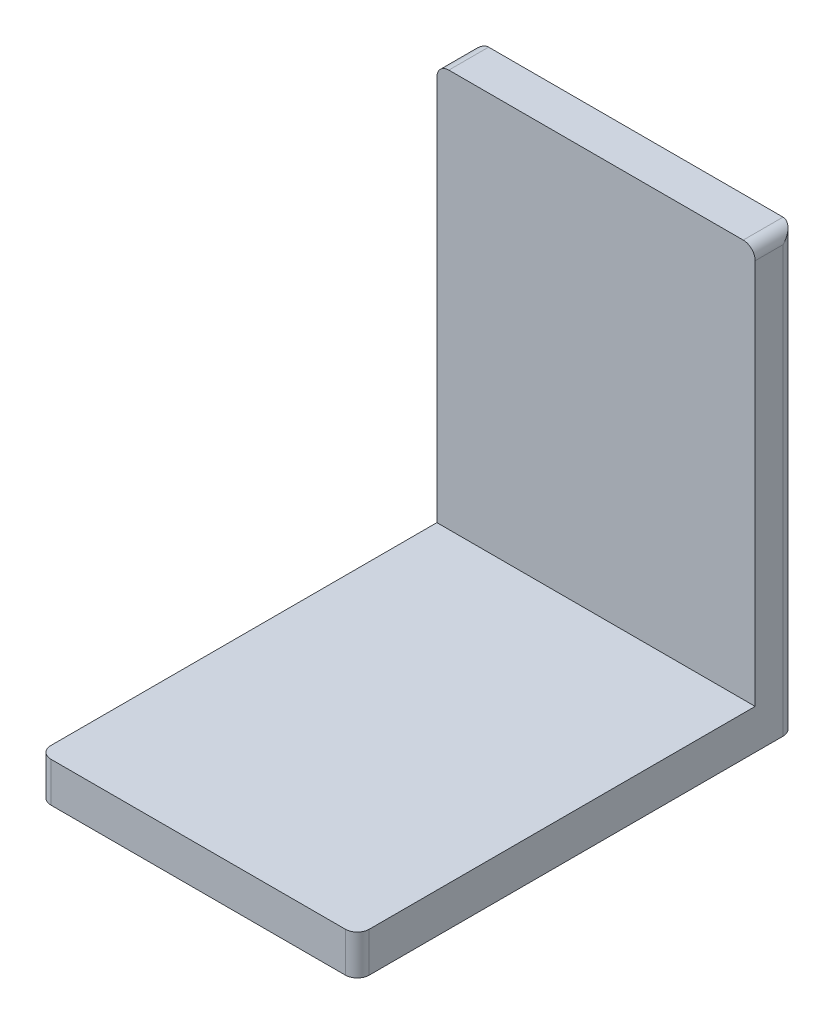
ISO-10303-21;
HEADER;
FILE_DESCRIPTION(('STEP AP214'),'2;1');
FILE_NAME('part.step','',(''),(''),'','','');
FILE_SCHEMA(('AUTOMOTIVE_DESIGN { 1 0 10303 214 1 1 1 1 }'));
ENDSEC;
DATA;
#1=APPLICATION_CONTEXT('core data for automotive mechanical design processes');
#2=APPLICATION_PROTOCOL_DEFINITION('international standard','automotive_design',2000,#1);
#3=PRODUCT_CONTEXT('',#1,'mechanical');
#4=PRODUCT('Part','Part','',(#3));
#5=PRODUCT_RELATED_PRODUCT_CATEGORY('part','',(#4));
#6=PRODUCT_DEFINITION_FORMATION('','',#4);
#7=PRODUCT_DEFINITION_CONTEXT('part definition',#1,'design');
#8=PRODUCT_DEFINITION('design','',#6,#7);
#9=PRODUCT_DEFINITION_SHAPE('','',#8);
#10=(LENGTH_UNIT() NAMED_UNIT(*) SI_UNIT(.MILLI.,.METRE.));
#11=(NAMED_UNIT(*) PLANE_ANGLE_UNIT() SI_UNIT($,.RADIAN.));
#12=(NAMED_UNIT(*) SI_UNIT($,.STERADIAN.) SOLID_ANGLE_UNIT());
#13=UNCERTAINTY_MEASURE_WITH_UNIT(LENGTH_MEASURE(1.E-05),#10,'distance_accuracy_value','');
#14=(GEOMETRIC_REPRESENTATION_CONTEXT(3) GLOBAL_UNCERTAINTY_ASSIGNED_CONTEXT((#13)) GLOBAL_UNIT_ASSIGNED_CONTEXT((#10,
#11,#12)) REPRESENTATION_CONTEXT('',''));
#15=CARTESIAN_POINT('',(0.,0.,0.));
#16=DIRECTION('',(0.,0.,1.));
#17=DIRECTION('',(1.,0.,0.));
#18=AXIS2_PLACEMENT_3D('',#15,#16,#17);
#19=CARTESIAN_POINT('',(80.,-10.,0.));
#20=DIRECTION('',(0.,-1.,0.));
#21=DIRECTION('',(0.,0.,-1.));
#22=AXIS2_PLACEMENT_3D('',#19,#20,#21);
#23=PLANE('',#22);
#24=DIRECTION('',(-1.,0.,0.));
#25=VECTOR('',#24,1.);
#26=CARTESIAN_POINT('',(80.,-10.,0.));
#27=LINE('',#26,#25);
#28=CARTESIAN_POINT('',(77.,-10.,0.));
#29=VERTEX_POINT('',#28);
#30=CARTESIAN_POINT('',(3.,-10.,0.));
#31=VERTEX_POINT('',#30);
#32=EDGE_CURVE('E131',#29,#31,#27,.T.);
#33=ORIENTED_EDGE('',*,*,#32,.T.);
#34=CARTESIAN_POINT('',(3.,-10.,-3.));
#35=DIRECTION('',(0.,-1.,0.));
#36=DIRECTION('',(0.,0.,-1.));
#37=AXIS2_PLACEMENT_3D('',#34,#35,#36);
#38=CIRCLE('',#37,3.);
#39=CARTESIAN_POINT('',(0.,-10.,-3.));
#40=VERTEX_POINT('',#39);
#41=EDGE_CURVE('E46',#31,#40,#38,.T.);
#42=ORIENTED_EDGE('',*,*,#41,.T.);
#43=DIRECTION('',(0.,0.,1.));
#44=VECTOR('',#43,1.);
#45=CARTESIAN_POINT('',(0.,-10.,0.));
#46=LINE('',#45,#44);
#47=CARTESIAN_POINT('',(0.,-9.99999999999999,-107.));
#48=VERTEX_POINT('',#47);
#49=EDGE_CURVE('E152',#48,#40,#46,.T.);
#50=ORIENTED_EDGE('',*,*,#49,.F.);
#51=CARTESIAN_POINT('',(3.,-9.99999999999999,-107.));
#52=DIRECTION('',(0.,-1.,0.));
#53=DIRECTION('',(0.,0.,-1.));
#54=AXIS2_PLACEMENT_3D('',#51,#52,#53);
#55=CIRCLE('',#54,3.);
#56=CARTESIAN_POINT('',(3.,-9.99999999999999,-110.));
#57=VERTEX_POINT('',#56);
#58=EDGE_CURVE('E173',#48,#57,#55,.T.);
#59=ORIENTED_EDGE('',*,*,#58,.T.);
#60=DIRECTION('',(-1.,0.,0.));
#61=VECTOR('',#60,1.);
#62=CARTESIAN_POINT('',(80.,-9.99999999999999,-110.));
#63=LINE('',#62,#61);
#64=CARTESIAN_POINT('',(77.,-9.99999999999999,-110.));
#65=VERTEX_POINT('',#64);
#66=EDGE_CURVE('E164',#65,#57,#63,.T.);
#67=ORIENTED_EDGE('',*,*,#66,.F.);
#68=CARTESIAN_POINT('',(77.,-9.99999999999999,-107.));
#69=DIRECTION('',(0.,-1.,0.));
#70=DIRECTION('',(0.,0.,-1.));
#71=AXIS2_PLACEMENT_3D('',#68,#69,#70);
#72=CIRCLE('',#71,3.);
#73=CARTESIAN_POINT('',(80.,-9.99999999999999,-107.));
#74=VERTEX_POINT('',#73);
#75=EDGE_CURVE('E171',#65,#74,#72,.T.);
#76=ORIENTED_EDGE('',*,*,#75,.T.);
#77=DIRECTION('',(0.,0.,1.));
#78=VECTOR('',#77,1.);
#79=CARTESIAN_POINT('',(80.,-10.,0.));
#80=LINE('',#79,#78);
#81=CARTESIAN_POINT('',(80.,-10.,-3.));
#82=VERTEX_POINT('',#81);
#83=EDGE_CURVE('E147',#74,#82,#80,.T.);
#84=ORIENTED_EDGE('',*,*,#83,.T.);
#85=CARTESIAN_POINT('',(77.,-10.,-3.));
#86=DIRECTION('',(0.,-1.,0.));
#87=DIRECTION('',(0.,0.,-1.));
#88=AXIS2_PLACEMENT_3D('',#85,#86,#87);
#89=CIRCLE('',#88,3.);
#90=EDGE_CURVE('E207',#82,#29,#89,.T.);
#91=ORIENTED_EDGE('',*,*,#90,.T.);
#92=EDGE_LOOP('',(#33,#42,#50,#59,#67,#76,#84,#91));
#93=FACE_BOUND('',#92,.T.);
#94=ADVANCED_FACE('F38',(#93),#23,.T.);
#95=CARTESIAN_POINT('',(80.,0.,-110.));
#96=DIRECTION('',(0.,0.,-1.));
#97=DIRECTION('',(0.,1.,0.));
#98=AXIS2_PLACEMENT_3D('',#95,#96,#97);
#99=PLANE('',#98);
#100=ORIENTED_EDGE('',*,*,#66,.T.);
#101=DIRECTION('',(0.,-1.,0.));
#102=VECTOR('',#101,1.);
#103=CARTESIAN_POINT('',(3.,100.,-110.));
#104=LINE('',#103,#102);
#105=CARTESIAN_POINT('',(3.,100.,-110.));
#106=VERTEX_POINT('',#105);
#107=EDGE_CURVE('E179',#57,#106,#104,.F.);
#108=ORIENTED_EDGE('',*,*,#107,.T.);
#109=DIRECTION('',(-1.,0.,0.));
#110=VECTOR('',#109,1.);
#111=CARTESIAN_POINT('',(80.,100.,-110.));
#112=LINE('',#111,#110);
#113=CARTESIAN_POINT('',(77.,100.,-110.));
#114=VERTEX_POINT('',#113);
#115=EDGE_CURVE('E161',#114,#106,#112,.T.);
#116=ORIENTED_EDGE('',*,*,#115,.F.);
#117=DIRECTION('',(0.,-1.,0.));
#118=VECTOR('',#117,1.);
#119=CARTESIAN_POINT('',(77.,0.,-110.));
#120=LINE('',#119,#118);
#121=EDGE_CURVE('E176',#114,#65,#120,.T.);
#122=ORIENTED_EDGE('',*,*,#121,.T.);
#123=EDGE_LOOP('',(#100,#108,#116,#122));
#124=FACE_BOUND('',#123,.T.);
#125=ADVANCED_FACE('F244',(#124),#99,.T.);
#126=CARTESIAN_POINT('',(80.,100.,0.));
#127=DIRECTION('',(0.,1.,0.));
#128=DIRECTION('',(0.,0.,1.));
#129=AXIS2_PLACEMENT_3D('',#126,#127,#128);
#130=PLANE('',#129);
#131=ORIENTED_EDGE('',*,*,#115,.T.);
#132=DIRECTION('',(0.,0.,-1.));
#133=VECTOR('',#132,1.);
#134=CARTESIAN_POINT('',(3.,100.,-100.));
#135=LINE('',#134,#133);
#136=CARTESIAN_POINT('',(3.,100.,-100.));
#137=VERTEX_POINT('',#136);
#138=EDGE_CURVE('E186',#106,#137,#135,.F.);
#139=ORIENTED_EDGE('',*,*,#138,.T.);
#140=DIRECTION('',(-1.,0.,0.));
#141=VECTOR('',#140,1.);
#142=CARTESIAN_POINT('',(80.,100.,-100.));
#143=LINE('',#142,#141);
#144=CARTESIAN_POINT('',(77.,100.,-100.));
#145=VERTEX_POINT('',#144);
#146=EDGE_CURVE('E141',#145,#137,#143,.T.);
#147=ORIENTED_EDGE('',*,*,#146,.F.);
#148=DIRECTION('',(0.,0.,-1.));
#149=VECTOR('',#148,1.);
#150=CARTESIAN_POINT('',(77.,100.,0.));
#151=LINE('',#150,#149);
#152=EDGE_CURVE('E184',#145,#114,#151,.T.);
#153=ORIENTED_EDGE('',*,*,#152,.T.);
#154=EDGE_LOOP('',(#131,#139,#147,#153));
#155=FACE_BOUND('',#154,.T.);
#156=ADVANCED_FACE('F233',(#155),#130,.T.);
#157=CARTESIAN_POINT('',(80.,0.,-100.));
#158=DIRECTION('',(0.,0.,1.));
#159=DIRECTION('',(1.,0.,0.));
#160=AXIS2_PLACEMENT_3D('',#157,#158,#159);
#161=PLANE('',#160);
#162=ORIENTED_EDGE('',*,*,#146,.T.);
#163=CARTESIAN_POINT('',(3.,97.,-100.));
#164=DIRECTION('',(0.,0.,1.));
#165=DIRECTION('',(1.,0.,0.));
#166=AXIS2_PLACEMENT_3D('',#163,#164,#165);
#167=CIRCLE('',#166,3.);
#168=CARTESIAN_POINT('',(0.,97.,-100.));
#169=VERTEX_POINT('',#168);
#170=EDGE_CURVE('E190',#137,#169,#167,.T.);
#171=ORIENTED_EDGE('',*,*,#170,.T.);
#172=DIRECTION('',(0.,1.,0.));
#173=VECTOR('',#172,1.);
#174=CARTESIAN_POINT('',(0.,0.,-100.));
#175=LINE('',#174,#173);
#176=CARTESIAN_POINT('',(0.,0.,-100.));
#177=VERTEX_POINT('',#176);
#178=EDGE_CURVE('E140',#177,#169,#175,.T.);
#179=ORIENTED_EDGE('',*,*,#178,.F.);
#180=DIRECTION('',(-1.,0.,0.));
#181=VECTOR('',#180,1.);
#182=CARTESIAN_POINT('',(80.,0.,-100.));
#183=LINE('',#182,#181);
#184=CARTESIAN_POINT('',(80.,0.,-100.));
#185=VERTEX_POINT('',#184);
#186=EDGE_CURVE('E126',#185,#177,#183,.T.);
#187=ORIENTED_EDGE('',*,*,#186,.F.);
#188=DIRECTION('',(0.,1.,0.));
#189=VECTOR('',#188,1.);
#190=CARTESIAN_POINT('',(80.,0.,-100.));
#191=LINE('',#190,#189);
#192=CARTESIAN_POINT('',(80.,97.,-100.));
#193=VERTEX_POINT('',#192);
#194=EDGE_CURVE('E132',#185,#193,#191,.T.);
#195=ORIENTED_EDGE('',*,*,#194,.T.);
#196=CARTESIAN_POINT('',(77.,97.,-100.));
#197=DIRECTION('',(0.,0.,1.));
#198=DIRECTION('',(1.,0.,0.));
#199=AXIS2_PLACEMENT_3D('',#196,#197,#198);
#200=CIRCLE('',#199,3.);
#201=EDGE_CURVE('E188',#193,#145,#200,.T.);
#202=ORIENTED_EDGE('',*,*,#201,.T.);
#203=EDGE_LOOP('',(#162,#171,#179,#187,#195,#202));
#204=FACE_BOUND('',#203,.T.);
#205=ADVANCED_FACE('F137',(#204),#161,.T.);
#206=CARTESIAN_POINT('',(80.,0.,0.));
#207=DIRECTION('',(0.,1.,0.));
#208=DIRECTION('',(0.,0.,1.));
#209=AXIS2_PLACEMENT_3D('',#206,#207,#208);
#210=PLANE('',#209);
#211=DIRECTION('',(0.,0.,-1.));
#212=VECTOR('',#211,1.);
#213=CARTESIAN_POINT('',(0.,0.,0.));
#214=LINE('',#213,#212);
#215=CARTESIAN_POINT('',(0.,0.,-3.));
#216=VERTEX_POINT('',#215);
#217=EDGE_CURVE('E149',#216,#177,#214,.T.);
#218=ORIENTED_EDGE('',*,*,#217,.F.);
#219=CARTESIAN_POINT('',(3.,0.,-3.));
#220=DIRECTION('',(0.,1.,0.));
#221=DIRECTION('',(0.,0.,1.));
#222=AXIS2_PLACEMENT_3D('',#219,#220,#221);
#223=CIRCLE('',#222,3.);
#224=CARTESIAN_POINT('',(3.,0.,0.));
#225=VERTEX_POINT('',#224);
#226=EDGE_CURVE('E201',#216,#225,#223,.T.);
#227=ORIENTED_EDGE('',*,*,#226,.T.);
#228=DIRECTION('',(-1.,0.,0.));
#229=VECTOR('',#228,1.);
#230=CARTESIAN_POINT('',(80.,0.,0.));
#231=LINE('',#230,#229);
#232=CARTESIAN_POINT('',(77.,0.,0.));
#233=VERTEX_POINT('',#232);
#234=EDGE_CURVE('E142',#233,#225,#231,.T.);
#235=ORIENTED_EDGE('',*,*,#234,.F.);
#236=CARTESIAN_POINT('',(77.,0.,-3.));
#237=DIRECTION('',(0.,1.,0.));
#238=DIRECTION('',(0.,0.,1.));
#239=AXIS2_PLACEMENT_3D('',#236,#237,#238);
#240=CIRCLE('',#239,3.);
#241=CARTESIAN_POINT('',(80.,0.,-3.));
#242=VERTEX_POINT('',#241);
#243=EDGE_CURVE('E129',#233,#242,#240,.T.);
#244=ORIENTED_EDGE('',*,*,#243,.T.);
#245=DIRECTION('',(0.,0.,-1.));
#246=VECTOR('',#245,1.);
#247=CARTESIAN_POINT('',(80.,0.,0.));
#248=LINE('',#247,#246);
#249=EDGE_CURVE('E122',#242,#185,#248,.T.);
#250=ORIENTED_EDGE('',*,*,#249,.T.);
#251=ORIENTED_EDGE('',*,*,#186,.T.);
#252=EDGE_LOOP('',(#218,#227,#235,#244,#250,#251));
#253=FACE_BOUND('',#252,.T.);
#254=ADVANCED_FACE('F125',(#253),#210,.T.);
#255=CARTESIAN_POINT('',(80.,0.,0.));
#256=DIRECTION('',(0.,0.,1.));
#257=DIRECTION('',(1.,0.,0.));
#258=AXIS2_PLACEMENT_3D('',#255,#256,#257);
#259=PLANE('',#258);
#260=ORIENTED_EDGE('',*,*,#234,.T.);
#261=DIRECTION('',(0.,1.,0.));
#262=VECTOR('',#261,1.);
#263=CARTESIAN_POINT('',(3.,-10.,0.));
#264=LINE('',#263,#262);
#265=EDGE_CURVE('E59',#225,#31,#264,.F.);
#266=ORIENTED_EDGE('',*,*,#265,.T.);
#267=ORIENTED_EDGE('',*,*,#32,.F.);
#268=DIRECTION('',(0.,1.,0.));
#269=VECTOR('',#268,1.);
#270=CARTESIAN_POINT('',(77.,0.,0.));
#271=LINE('',#270,#269);
#272=EDGE_CURVE('E203',#29,#233,#271,.T.);
#273=ORIENTED_EDGE('',*,*,#272,.T.);
#274=EDGE_LOOP('',(#260,#266,#267,#273));
#275=FACE_BOUND('',#274,.T.);
#276=ADVANCED_FACE('F217',(#275),#259,.T.);
#277=CARTESIAN_POINT('',(80.,0.,0.));
#278=DIRECTION('',(1.,0.,0.));
#279=DIRECTION('',(0.,0.,-1.));
#280=AXIS2_PLACEMENT_3D('',#277,#278,#279);
#281=PLANE('',#280);
#282=ORIENTED_EDGE('',*,*,#249,.F.);
#283=DIRECTION('',(0.,1.,0.));
#284=VECTOR('',#283,1.);
#285=CARTESIAN_POINT('',(80.,0.,-3.));
#286=LINE('',#285,#284);
#287=EDGE_CURVE('E11',#242,#82,#286,.F.);
#288=ORIENTED_EDGE('',*,*,#287,.T.);
#289=ORIENTED_EDGE('',*,*,#83,.F.);
#290=DIRECTION('',(0.,-1.,0.));
#291=VECTOR('',#290,1.);
#292=CARTESIAN_POINT('',(80.,0.,-107.));
#293=LINE('',#292,#291);
#294=CARTESIAN_POINT('',(80.,97.,-107.));
#295=VERTEX_POINT('',#294);
#296=EDGE_CURVE('E182',#74,#295,#293,.F.);
#297=ORIENTED_EDGE('',*,*,#296,.T.);
#298=DIRECTION('',(0.,0.,-1.));
#299=VECTOR('',#298,1.);
#300=CARTESIAN_POINT('',(80.,97.,0.));
#301=LINE('',#300,#299);
#302=EDGE_CURVE('E146',#295,#193,#301,.F.);
#303=ORIENTED_EDGE('',*,*,#302,.T.);
#304=ORIENTED_EDGE('',*,*,#194,.F.);
#305=EDGE_LOOP('',(#282,#288,#289,#297,#303,#304));
#306=FACE_BOUND('',#305,.T.);
#307=ADVANCED_FACE('F144',(#306),#281,.T.);
#308=CARTESIAN_POINT('',(0.,0.,0.));
#309=DIRECTION('',(1.,0.,0.));
#310=DIRECTION('',(0.,0.,-1.));
#311=AXIS2_PLACEMENT_3D('',#308,#309,#310);
#312=PLANE('',#311);
#313=ORIENTED_EDGE('',*,*,#49,.T.);
#314=DIRECTION('',(0.,1.,0.));
#315=VECTOR('',#314,1.);
#316=CARTESIAN_POINT('',(0.,0.,-3.));
#317=LINE('',#316,#315);
#318=EDGE_CURVE('E192',#40,#216,#317,.T.);
#319=ORIENTED_EDGE('',*,*,#318,.T.);
#320=ORIENTED_EDGE('',*,*,#217,.T.);
#321=ORIENTED_EDGE('',*,*,#178,.T.);
#322=DIRECTION('',(0.,0.,-1.));
#323=VECTOR('',#322,1.);
#324=CARTESIAN_POINT('',(0.,97.,-110.));
#325=LINE('',#324,#323);
#326=CARTESIAN_POINT('',(0.,97.,-107.));
#327=VERTEX_POINT('',#326);
#328=EDGE_CURVE('E166',#169,#327,#325,.T.);
#329=ORIENTED_EDGE('',*,*,#328,.T.);
#330=DIRECTION('',(0.,-1.,0.));
#331=VECTOR('',#330,1.);
#332=CARTESIAN_POINT('',(0.,-9.99999999999999,-107.));
#333=LINE('',#332,#331);
#334=EDGE_CURVE('E168',#327,#48,#333,.T.);
#335=ORIENTED_EDGE('',*,*,#334,.T.);
#336=EDGE_LOOP('',(#313,#319,#320,#321,#329,#335));
#337=FACE_BOUND('',#336,.T.);
#338=ADVANCED_FACE('F214',(#337),#312,.F.);
#339=CARTESIAN_POINT('',(3.,97.,0.));
#340=DIRECTION('',(0.,0.,1.));
#341=DIRECTION('',(1.,0.,0.));
#342=AXIS2_PLACEMENT_3D('',#339,#340,#341);
#343=CYLINDRICAL_SURFACE('',#342,3.);
#344=ORIENTED_EDGE('',*,*,#170,.F.);
#345=ORIENTED_EDGE('',*,*,#138,.F.);
#346=CARTESIAN_POINT('',(3.,97.,-107.));
#347=DIRECTION('',(0.,0.707106781186547,0.707106781186548));
#348=DIRECTION('',(0.,-0.707106781186548,0.707106781186547));
#349=AXIS2_PLACEMENT_3D('',#346,#347,#348);
#350=ELLIPSE('',#349,4.24264068711928,3.);
#351=EDGE_CURVE('E155',#327,#106,#350,.F.);
#352=ORIENTED_EDGE('',*,*,#351,.F.);
#353=ORIENTED_EDGE('',*,*,#328,.F.);
#354=EDGE_LOOP('',(#344,#345,#352,#353));
#355=FACE_BOUND('',#354,.T.);
#356=ADVANCED_FACE('F238',(#355),#343,.T.);
#357=CARTESIAN_POINT('',(3.,0.,-107.));
#358=DIRECTION('',(0.,1.,0.));
#359=DIRECTION('',(0.,0.,1.));
#360=AXIS2_PLACEMENT_3D('',#357,#358,#359);
#361=CYLINDRICAL_SURFACE('',#360,3.);
#362=ORIENTED_EDGE('',*,*,#351,.T.);
#363=ORIENTED_EDGE('',*,*,#107,.F.);
#364=ORIENTED_EDGE('',*,*,#58,.F.);
#365=ORIENTED_EDGE('',*,*,#334,.F.);
#366=EDGE_LOOP('',(#362,#363,#364,#365));
#367=FACE_BOUND('',#366,.T.);
#368=ADVANCED_FACE('F242',(#367),#361,.T.);
#369=CARTESIAN_POINT('',(77.,97.,0.));
#370=DIRECTION('',(0.,0.,-1.));
#371=DIRECTION('',(-1.,0.,0.));
#372=AXIS2_PLACEMENT_3D('',#369,#370,#371);
#373=CYLINDRICAL_SURFACE('',#372,3.);
#374=ORIENTED_EDGE('',*,*,#201,.F.);
#375=ORIENTED_EDGE('',*,*,#302,.F.);
#376=CARTESIAN_POINT('',(77.,97.,-107.));
#377=DIRECTION('',(0.,-0.707106781186547,-0.707106781186548));
#378=DIRECTION('',(0.,0.707106781186548,-0.707106781186547));
#379=AXIS2_PLACEMENT_3D('',#376,#377,#378);
#380=ELLIPSE('',#379,4.24264068711928,3.);
#381=EDGE_CURVE('E195',#114,#295,#380,.T.);
#382=ORIENTED_EDGE('',*,*,#381,.F.);
#383=ORIENTED_EDGE('',*,*,#152,.F.);
#384=EDGE_LOOP('',(#374,#375,#382,#383));
#385=FACE_BOUND('',#384,.T.);
#386=ADVANCED_FACE('F229',(#385),#373,.T.);
#387=CARTESIAN_POINT('',(77.,0.,-107.));
#388=DIRECTION('',(0.,-1.,0.));
#389=DIRECTION('',(0.,0.,-1.));
#390=AXIS2_PLACEMENT_3D('',#387,#388,#389);
#391=CYLINDRICAL_SURFACE('',#390,3.);
#392=ORIENTED_EDGE('',*,*,#381,.T.);
#393=ORIENTED_EDGE('',*,*,#296,.F.);
#394=ORIENTED_EDGE('',*,*,#75,.F.);
#395=ORIENTED_EDGE('',*,*,#121,.F.);
#396=EDGE_LOOP('',(#392,#393,#394,#395));
#397=FACE_BOUND('',#396,.T.);
#398=ADVANCED_FACE('F224',(#397),#391,.T.);
#399=CARTESIAN_POINT('',(3.,0.,-3.));
#400=DIRECTION('',(0.,-1.,0.));
#401=DIRECTION('',(0.,0.,-1.));
#402=AXIS2_PLACEMENT_3D('',#399,#400,#401);
#403=CYLINDRICAL_SURFACE('',#402,3.);
#404=ORIENTED_EDGE('',*,*,#41,.F.);
#405=ORIENTED_EDGE('',*,*,#265,.F.);
#406=ORIENTED_EDGE('',*,*,#226,.F.);
#407=ORIENTED_EDGE('',*,*,#318,.F.);
#408=EDGE_LOOP('',(#404,#405,#406,#407));
#409=FACE_BOUND('',#408,.T.);
#410=ADVANCED_FACE('F216',(#409),#403,.T.);
#411=CARTESIAN_POINT('',(77.,0.,-3.));
#412=DIRECTION('',(0.,1.,0.));
#413=DIRECTION('',(0.,0.,1.));
#414=AXIS2_PLACEMENT_3D('',#411,#412,#413);
#415=CYLINDRICAL_SURFACE('',#414,3.);
#416=ORIENTED_EDGE('',*,*,#90,.F.);
#417=ORIENTED_EDGE('',*,*,#287,.F.);
#418=ORIENTED_EDGE('',*,*,#243,.F.);
#419=ORIENTED_EDGE('',*,*,#272,.F.);
#420=EDGE_LOOP('',(#416,#417,#418,#419));
#421=FACE_BOUND('',#420,.T.);
#422=ADVANCED_FACE('F40',(#421),#415,.T.);
#423=CLOSED_SHELL('',(#94,#125,#156,#205,#254,#276,#307,#338,#356,#368,#386,#398,#410,#422));
#424=MANIFOLD_SOLID_BREP('B2',#423);
#425=ADVANCED_BREP_SHAPE_REPRESENTATION('',(#18,#424),#14);
#426=SHAPE_DEFINITION_REPRESENTATION(#9,#425);
ENDSEC;
END-ISO-10303-21;
